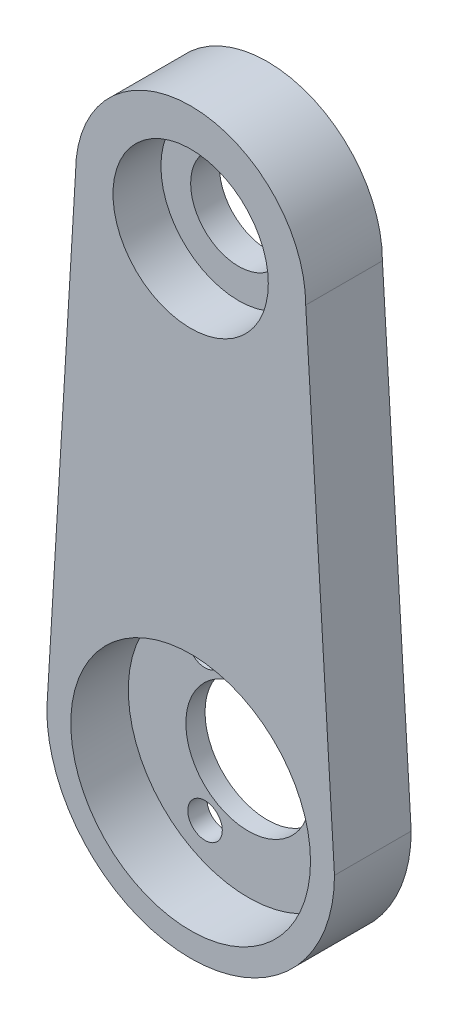
ISO-10303-21;
HEADER;
FILE_DESCRIPTION(('STEP AP214'),'2;1');
FILE_NAME('part.step','',(''),(''),'','','');
FILE_SCHEMA(('AUTOMOTIVE_DESIGN { 1 0 10303 214 1 1 1 1 }'));
ENDSEC;
DATA;
#1=APPLICATION_CONTEXT('core data for automotive mechanical design processes');
#2=APPLICATION_PROTOCOL_DEFINITION('international standard','automotive_design',2000,#1);
#3=PRODUCT_CONTEXT('',#1,'mechanical');
#4=PRODUCT('Part','Part','',(#3));
#5=PRODUCT_RELATED_PRODUCT_CATEGORY('part','',(#4));
#6=PRODUCT_DEFINITION_FORMATION('','',#4);
#7=PRODUCT_DEFINITION_CONTEXT('part definition',#1,'design');
#8=PRODUCT_DEFINITION('design','',#6,#7);
#9=PRODUCT_DEFINITION_SHAPE('','',#8);
#10=(LENGTH_UNIT() NAMED_UNIT(*) SI_UNIT(.MILLI.,.METRE.));
#11=(NAMED_UNIT(*) PLANE_ANGLE_UNIT() SI_UNIT($,.RADIAN.));
#12=(NAMED_UNIT(*) SI_UNIT($,.STERADIAN.) SOLID_ANGLE_UNIT());
#13=UNCERTAINTY_MEASURE_WITH_UNIT(LENGTH_MEASURE(1.E-05),#10,'distance_accuracy_value','');
#14=(GEOMETRIC_REPRESENTATION_CONTEXT(3) GLOBAL_UNCERTAINTY_ASSIGNED_CONTEXT((#13)) GLOBAL_UNIT_ASSIGNED_CONTEXT((#10,
#11,#12)) REPRESENTATION_CONTEXT('',''));
#15=CARTESIAN_POINT('',(0.,0.,0.));
#16=DIRECTION('',(0.,0.,1.));
#17=DIRECTION('',(1.,0.,0.));
#18=AXIS2_PLACEMENT_3D('',#15,#16,#17);
#19=CARTESIAN_POINT('',(0.,0.,-2.));
#20=DIRECTION('',(0.,0.,1.));
#21=DIRECTION('',(1.,0.,0.));
#22=AXIS2_PLACEMENT_3D('',#19,#20,#21);
#23=CYLINDRICAL_SURFACE('',#22,8.1);
#24=CARTESIAN_POINT('',(0.,0.,8.));
#25=DIRECTION('',(0.,0.,1.));
#26=DIRECTION('',(1.,0.,0.));
#27=AXIS2_PLACEMENT_3D('',#24,#25,#26);
#28=CIRCLE('',#27,8.1);
#29=CARTESIAN_POINT('',(8.1,0.,8.));
#30=VERTEX_POINT('',#29);
#31=EDGE_CURVE('E141',#30,#30,#28,.T.);
#32=ORIENTED_EDGE('',*,*,#31,.T.);
#33=EDGE_LOOP('',(#32));
#34=FACE_BOUND('',#33,.T.);
#35=CARTESIAN_POINT('',(0.,0.,3.));
#36=DIRECTION('',(0.,0.,-1.));
#37=DIRECTION('',(-1.,0.,0.));
#38=AXIS2_PLACEMENT_3D('',#35,#36,#37);
#39=CIRCLE('',#38,8.1);
#40=CARTESIAN_POINT('',(-8.1,0.,3.));
#41=VERTEX_POINT('',#40);
#42=EDGE_CURVE('E11',#41,#41,#39,.F.);
#43=ORIENTED_EDGE('',*,*,#42,.F.);
#44=EDGE_LOOP('',(#43));
#45=FACE_BOUND('',#44,.T.);
#46=ADVANCED_FACE('F38',(#34,#45),#23,.F.);
#47=CARTESIAN_POINT('',(0.,-50.,-2.));
#48=DIRECTION('',(0.,0.,1.));
#49=DIRECTION('',(1.,0.,0.));
#50=AXIS2_PLACEMENT_3D('',#47,#48,#49);
#51=CYLINDRICAL_SURFACE('',#50,6.5);
#52=CARTESIAN_POINT('',(0.,-50.,0.));
#53=DIRECTION('',(0.,0.,-1.));
#54=DIRECTION('',(-1.,0.,0.));
#55=AXIS2_PLACEMENT_3D('',#52,#53,#54);
#56=CIRCLE('',#55,6.5);
#57=CARTESIAN_POINT('',(-6.49999999999999,-50.,0.));
#58=VERTEX_POINT('',#57);
#59=EDGE_CURVE('E108',#58,#58,#56,.T.);
#60=ORIENTED_EDGE('',*,*,#59,.T.);
#61=EDGE_LOOP('',(#60));
#62=FACE_BOUND('',#61,.T.);
#63=CARTESIAN_POINT('',(0.,-50.,2.));
#64=DIRECTION('',(0.,0.,1.));
#65=DIRECTION('',(1.,0.,0.));
#66=AXIS2_PLACEMENT_3D('',#63,#64,#65);
#67=CIRCLE('',#66,6.5);
#68=CARTESIAN_POINT('',(6.50000000000001,-50.,2.));
#69=VERTEX_POINT('',#68);
#70=EDGE_CURVE('E122',#69,#69,#67,.F.);
#71=ORIENTED_EDGE('',*,*,#70,.F.);
#72=EDGE_LOOP('',(#71));
#73=FACE_BOUND('',#72,.T.);
#74=ADVANCED_FACE('F153',(#62,#73),#51,.F.);
#75=CARTESIAN_POINT('',(9.00000000000001,-50.,-2.));
#76=DIRECTION('',(0.,0.,1.));
#77=DIRECTION('',(1.,0.,0.));
#78=AXIS2_PLACEMENT_3D('',#75,#76,#77);
#79=CYLINDRICAL_SURFACE('',#78,1.8);
#80=CARTESIAN_POINT('',(9.00000000000001,-50.,0.));
#81=DIRECTION('',(0.,0.,-1.));
#82=DIRECTION('',(-1.,0.,0.));
#83=AXIS2_PLACEMENT_3D('',#80,#81,#82);
#84=CIRCLE('',#83,1.8);
#85=CARTESIAN_POINT('',(7.20000000000001,-50.,0.));
#86=VERTEX_POINT('',#85);
#87=EDGE_CURVE('E118',#86,#86,#84,.T.);
#88=ORIENTED_EDGE('',*,*,#87,.T.);
#89=EDGE_LOOP('',(#88));
#90=FACE_BOUND('',#89,.T.);
#91=CARTESIAN_POINT('',(9.00000000000001,-50.,2.));
#92=DIRECTION('',(0.,0.,1.));
#93=DIRECTION('',(1.,0.,0.));
#94=AXIS2_PLACEMENT_3D('',#91,#92,#93);
#95=CIRCLE('',#94,1.8);
#96=CARTESIAN_POINT('',(10.8,-50.,2.));
#97=VERTEX_POINT('',#96);
#98=EDGE_CURVE('E133',#97,#97,#95,.F.);
#99=ORIENTED_EDGE('',*,*,#98,.F.);
#100=EDGE_LOOP('',(#99));
#101=FACE_BOUND('',#100,.T.);
#102=ADVANCED_FACE('F155',(#90,#101),#79,.F.);
#103=CARTESIAN_POINT('',(-4.49999999999992,-42.20577136594,-2.));
#104=DIRECTION('',(0.,0.,1.));
#105=DIRECTION('',(1.,0.,0.));
#106=AXIS2_PLACEMENT_3D('',#103,#104,#105);
#107=CYLINDRICAL_SURFACE('',#106,1.8);
#108=CARTESIAN_POINT('',(-4.49999999999992,-42.20577136594,0.));
#109=DIRECTION('',(0.,0.,-1.));
#110=DIRECTION('',(-1.,0.,0.));
#111=AXIS2_PLACEMENT_3D('',#108,#109,#110);
#112=CIRCLE('',#111,1.8);
#113=CARTESIAN_POINT('',(-6.29999999999992,-42.20577136594,0.));
#114=VERTEX_POINT('',#113);
#115=EDGE_CURVE('E121',#114,#114,#112,.T.);
#116=ORIENTED_EDGE('',*,*,#115,.T.);
#117=EDGE_LOOP('',(#116));
#118=FACE_BOUND('',#117,.T.);
#119=CARTESIAN_POINT('',(-4.49999999999992,-42.20577136594,2.));
#120=DIRECTION('',(0.,0.,1.));
#121=DIRECTION('',(1.,0.,0.));
#122=AXIS2_PLACEMENT_3D('',#119,#120,#121);
#123=CIRCLE('',#122,1.8);
#124=CARTESIAN_POINT('',(-2.69999999999992,-42.20577136594,2.));
#125=VERTEX_POINT('',#124);
#126=EDGE_CURVE('E128',#125,#125,#123,.F.);
#127=ORIENTED_EDGE('',*,*,#126,.F.);
#128=EDGE_LOOP('',(#127));
#129=FACE_BOUND('',#128,.T.);
#130=ADVANCED_FACE('F162',(#118,#129),#107,.F.);
#131=CARTESIAN_POINT('',(-4.50000000000003,-57.7942286340599,-2.));
#132=DIRECTION('',(0.,0.,1.));
#133=DIRECTION('',(1.,0.,0.));
#134=AXIS2_PLACEMENT_3D('',#131,#132,#133);
#135=CYLINDRICAL_SURFACE('',#134,1.8);
#136=CARTESIAN_POINT('',(-4.50000000000003,-57.7942286340599,0.));
#137=DIRECTION('',(0.,0.,-1.));
#138=DIRECTION('',(-1.,0.,0.));
#139=AXIS2_PLACEMENT_3D('',#136,#137,#138);
#140=CIRCLE('',#139,1.8);
#141=CARTESIAN_POINT('',(-6.30000000000003,-57.7942286340599,0.));
#142=VERTEX_POINT('',#141);
#143=EDGE_CURVE('E117',#142,#142,#140,.T.);
#144=ORIENTED_EDGE('',*,*,#143,.T.);
#145=EDGE_LOOP('',(#144));
#146=FACE_BOUND('',#145,.T.);
#147=CARTESIAN_POINT('',(-4.50000000000003,-57.7942286340599,2.));
#148=DIRECTION('',(0.,0.,1.));
#149=DIRECTION('',(1.,0.,0.));
#150=AXIS2_PLACEMENT_3D('',#147,#148,#149);
#151=CIRCLE('',#150,1.8);
#152=CARTESIAN_POINT('',(-2.70000000000003,-57.7942286340599,2.));
#153=VERTEX_POINT('',#152);
#154=EDGE_CURVE('E126',#153,#153,#151,.F.);
#155=ORIENTED_EDGE('',*,*,#154,.F.);
#156=EDGE_LOOP('',(#155));
#157=FACE_BOUND('',#156,.T.);
#158=ADVANCED_FACE('F184',(#146,#157),#135,.F.);
#159=CARTESIAN_POINT('',(0.,0.,8.));
#160=DIRECTION('',(0.,0.,-1.));
#161=DIRECTION('',(-1.,0.,0.));
#162=AXIS2_PLACEMENT_3D('',#159,#160,#161);
#163=CYLINDRICAL_SURFACE('',#162,12.);
#164=CARTESIAN_POINT('',(0.,0.,0.));
#165=DIRECTION('',(0.,0.,1.));
#166=DIRECTION('',(-1.,0.,0.));
#167=AXIS2_PLACEMENT_3D('',#164,#165,#166);
#168=CIRCLE('',#167,12.);
#169=CARTESIAN_POINT('',(12.,0.,0.));
#170=VERTEX_POINT('',#169);
#171=CARTESIAN_POINT('',(-12.,0.,0.));
#172=VERTEX_POINT('',#171);
#173=EDGE_CURVE('E105',#170,#172,#168,.T.);
#174=ORIENTED_EDGE('',*,*,#173,.T.);
#175=DIRECTION('',(0.,0.,-1.));
#176=VECTOR('',#175,1.);
#177=CARTESIAN_POINT('',(-12.,0.,8.));
#178=LINE('',#177,#176);
#179=CARTESIAN_POINT('',(-12.,0.,8.));
#180=VERTEX_POINT('',#179);
#181=EDGE_CURVE('E47',#180,#172,#178,.T.);
#182=ORIENTED_EDGE('',*,*,#181,.F.);
#183=CARTESIAN_POINT('',(0.,0.,8.));
#184=DIRECTION('',(0.,0.,1.));
#185=DIRECTION('',(-1.,0.,0.));
#186=AXIS2_PLACEMENT_3D('',#183,#184,#185);
#187=CIRCLE('',#186,12.);
#188=CARTESIAN_POINT('',(12.,0.,8.));
#189=VERTEX_POINT('',#188);
#190=EDGE_CURVE('E91',#189,#180,#187,.T.);
#191=ORIENTED_EDGE('',*,*,#190,.F.);
#192=DIRECTION('',(0.,0.,-1.));
#193=VECTOR('',#192,1.);
#194=CARTESIAN_POINT('',(12.,0.,8.));
#195=LINE('',#194,#193);
#196=EDGE_CURVE('E101',#189,#170,#195,.T.);
#197=ORIENTED_EDGE('',*,*,#196,.T.);
#198=EDGE_LOOP('',(#174,#182,#191,#197));
#199=FACE_BOUND('',#198,.T.);
#200=ADVANCED_FACE('F40',(#199),#163,.T.);
#201=CARTESIAN_POINT('',(-12.,0.,8.));
#202=DIRECTION('',(0.998204845465779,-0.0598922907279466,0.));
#203=DIRECTION('',(0.0598922907279466,0.998204845465779,0.));
#204=AXIS2_PLACEMENT_3D('',#201,#202,#203);
#205=PLANE('',#204);
#206=DIRECTION('',(-0.0598922907279466,-0.998204845465779,0.));
#207=VECTOR('',#206,1.);
#208=CARTESIAN_POINT('',(-12.,0.,0.));
#209=LINE('',#208,#207);
#210=CARTESIAN_POINT('',(-15.,-50.,0.));
#211=VERTEX_POINT('',#210);
#212=EDGE_CURVE('E96',#172,#211,#209,.T.);
#213=ORIENTED_EDGE('',*,*,#212,.T.);
#214=DIRECTION('',(0.,0.,-1.));
#215=VECTOR('',#214,1.);
#216=CARTESIAN_POINT('',(-15.,-50.,8.));
#217=LINE('',#216,#215);
#218=CARTESIAN_POINT('',(-15.,-50.,8.));
#219=VERTEX_POINT('',#218);
#220=EDGE_CURVE('E94',#219,#211,#217,.T.);
#221=ORIENTED_EDGE('',*,*,#220,.F.);
#222=DIRECTION('',(-0.0598922907279466,-0.998204845465779,0.));
#223=VECTOR('',#222,1.);
#224=CARTESIAN_POINT('',(-12.,0.,8.));
#225=LINE('',#224,#223);
#226=EDGE_CURVE('E86',#180,#219,#225,.T.);
#227=ORIENTED_EDGE('',*,*,#226,.F.);
#228=ORIENTED_EDGE('',*,*,#181,.T.);
#229=EDGE_LOOP('',(#213,#221,#227,#228));
#230=FACE_BOUND('',#229,.T.);
#231=ADVANCED_FACE('F95',(#230),#205,.F.);
#232=CARTESIAN_POINT('',(0.,-50.,8.));
#233=DIRECTION('',(0.,0.,-1.));
#234=DIRECTION('',(-1.,0.,0.));
#235=AXIS2_PLACEMENT_3D('',#232,#233,#234);
#236=CYLINDRICAL_SURFACE('',#235,15.);
#237=CARTESIAN_POINT('',(0.,-50.,0.));
#238=DIRECTION('',(0.,0.,1.));
#239=DIRECTION('',(1.,0.,0.));
#240=AXIS2_PLACEMENT_3D('',#237,#238,#239);
#241=CIRCLE('',#240,15.);
#242=CARTESIAN_POINT('',(15.,-50.,0.));
#243=VERTEX_POINT('',#242);
#244=EDGE_CURVE('E72',#211,#243,#241,.T.);
#245=ORIENTED_EDGE('',*,*,#244,.T.);
#246=DIRECTION('',(0.,0.,-1.));
#247=VECTOR('',#246,1.);
#248=CARTESIAN_POINT('',(15.,-50.,8.));
#249=LINE('',#248,#247);
#250=CARTESIAN_POINT('',(15.,-50.,8.));
#251=VERTEX_POINT('',#250);
#252=EDGE_CURVE('E97',#251,#243,#249,.T.);
#253=ORIENTED_EDGE('',*,*,#252,.F.);
#254=CARTESIAN_POINT('',(0.,-50.,8.));
#255=DIRECTION('',(0.,0.,1.));
#256=DIRECTION('',(1.,0.,0.));
#257=AXIS2_PLACEMENT_3D('',#254,#255,#256);
#258=CIRCLE('',#257,15.);
#259=EDGE_CURVE('E89',#219,#251,#258,.T.);
#260=ORIENTED_EDGE('',*,*,#259,.F.);
#261=ORIENTED_EDGE('',*,*,#220,.T.);
#262=EDGE_LOOP('',(#245,#253,#260,#261));
#263=FACE_BOUND('',#262,.T.);
#264=ADVANCED_FACE('F99',(#263),#236,.T.);
#265=CARTESIAN_POINT('',(12.,0.,8.));
#266=DIRECTION('',(-0.998204845465779,-0.0598922907279466,0.));
#267=DIRECTION('',(0.0598922907279466,-0.998204845465779,0.));
#268=AXIS2_PLACEMENT_3D('',#265,#266,#267);
#269=PLANE('',#268);
#270=DIRECTION('',(-0.0598922907279466,0.998204845465779,0.));
#271=VECTOR('',#270,1.);
#272=CARTESIAN_POINT('',(12.,0.,0.));
#273=LINE('',#272,#271);
#274=EDGE_CURVE('E78',#243,#170,#273,.T.);
#275=ORIENTED_EDGE('',*,*,#274,.T.);
#276=ORIENTED_EDGE('',*,*,#196,.F.);
#277=DIRECTION('',(-0.0598922907279466,0.998204845465779,0.));
#278=VECTOR('',#277,1.);
#279=CARTESIAN_POINT('',(12.,0.,8.));
#280=LINE('',#279,#278);
#281=EDGE_CURVE('E55',#251,#189,#280,.T.);
#282=ORIENTED_EDGE('',*,*,#281,.F.);
#283=ORIENTED_EDGE('',*,*,#252,.T.);
#284=EDGE_LOOP('',(#275,#276,#282,#283));
#285=FACE_BOUND('',#284,.T.);
#286=ADVANCED_FACE('F172',(#285),#269,.F.);
#287=CARTESIAN_POINT('',(0.,0.,8.));
#288=DIRECTION('',(0.,0.,-1.));
#289=DIRECTION('',(-1.,0.,0.));
#290=AXIS2_PLACEMENT_3D('',#287,#288,#289);
#291=PLANE('',#290);
#292=ORIENTED_EDGE('',*,*,#31,.F.);
#293=EDGE_LOOP('',(#292));
#294=FACE_BOUND('',#293,.T.);
#295=CARTESIAN_POINT('',(0.,-50.,8.));
#296=DIRECTION('',(0.,0.,1.));
#297=DIRECTION('',(1.,0.,0.));
#298=AXIS2_PLACEMENT_3D('',#295,#296,#297);
#299=CIRCLE('',#298,12.5);
#300=CARTESIAN_POINT('',(12.5,-50.,8.));
#301=VERTEX_POINT('',#300);
#302=EDGE_CURVE('E136',#301,#301,#299,.T.);
#303=ORIENTED_EDGE('',*,*,#302,.F.);
#304=EDGE_LOOP('',(#303));
#305=FACE_BOUND('',#304,.T.);
#306=ORIENTED_EDGE('',*,*,#190,.T.);
#307=ORIENTED_EDGE('',*,*,#226,.T.);
#308=ORIENTED_EDGE('',*,*,#259,.T.);
#309=ORIENTED_EDGE('',*,*,#281,.T.);
#310=EDGE_LOOP('',(#306,#307,#308,#309));
#311=FACE_BOUND('',#310,.T.);
#312=ADVANCED_FACE('F87',(#294,#305,#311),#291,.F.);
#313=CARTESIAN_POINT('',(0.,0.,0.));
#314=DIRECTION('',(0.,0.,-1.));
#315=DIRECTION('',(-1.,0.,0.));
#316=AXIS2_PLACEMENT_3D('',#313,#314,#315);
#317=PLANE('',#316);
#318=ORIENTED_EDGE('',*,*,#143,.F.);
#319=EDGE_LOOP('',(#318));
#320=FACE_BOUND('',#319,.T.);
#321=ORIENTED_EDGE('',*,*,#115,.F.);
#322=EDGE_LOOP('',(#321));
#323=FACE_BOUND('',#322,.T.);
#324=ORIENTED_EDGE('',*,*,#87,.F.);
#325=EDGE_LOOP('',(#324));
#326=FACE_BOUND('',#325,.T.);
#327=ORIENTED_EDGE('',*,*,#59,.F.);
#328=EDGE_LOOP('',(#327));
#329=FACE_BOUND('',#328,.T.);
#330=ORIENTED_EDGE('',*,*,#173,.F.);
#331=ORIENTED_EDGE('',*,*,#274,.F.);
#332=ORIENTED_EDGE('',*,*,#244,.F.);
#333=ORIENTED_EDGE('',*,*,#212,.F.);
#334=EDGE_LOOP('',(#330,#331,#332,#333));
#335=FACE_BOUND('',#334,.T.);
#336=CARTESIAN_POINT('',(0.,0.,0.));
#337=DIRECTION('',(0.,0.,-1.));
#338=DIRECTION('',(-1.,0.,0.));
#339=AXIS2_PLACEMENT_3D('',#336,#337,#338);
#340=CIRCLE('',#339,5.);
#341=CARTESIAN_POINT('',(-5.,0.,0.));
#342=VERTEX_POINT('',#341);
#343=EDGE_CURVE('E196',#342,#342,#340,.T.);
#344=ORIENTED_EDGE('',*,*,#343,.F.);
#345=EDGE_LOOP('',(#344));
#346=FACE_BOUND('',#345,.T.);
#347=ADVANCED_FACE('F171',(#320,#323,#326,#329,#335,#346),#317,.T.);
#348=CARTESIAN_POINT('',(0.,-50.,2.));
#349=DIRECTION('',(0.,0.,1.));
#350=DIRECTION('',(1.,0.,0.));
#351=AXIS2_PLACEMENT_3D('',#348,#349,#350);
#352=PLANE('',#351);
#353=CARTESIAN_POINT('',(0.,-50.,2.));
#354=DIRECTION('',(0.,0.,1.));
#355=DIRECTION('',(1.,0.,0.));
#356=AXIS2_PLACEMENT_3D('',#353,#354,#355);
#357=CIRCLE('',#356,12.5);
#358=CARTESIAN_POINT('',(12.5,-50.,2.));
#359=VERTEX_POINT('',#358);
#360=EDGE_CURVE('E129',#359,#359,#357,.T.);
#361=ORIENTED_EDGE('',*,*,#360,.T.);
#362=EDGE_LOOP('',(#361));
#363=FACE_BOUND('',#362,.T.);
#364=ORIENTED_EDGE('',*,*,#154,.T.);
#365=EDGE_LOOP('',(#364));
#366=FACE_BOUND('',#365,.T.);
#367=ORIENTED_EDGE('',*,*,#126,.T.);
#368=EDGE_LOOP('',(#367));
#369=FACE_BOUND('',#368,.T.);
#370=ORIENTED_EDGE('',*,*,#98,.T.);
#371=EDGE_LOOP('',(#370));
#372=FACE_BOUND('',#371,.T.);
#373=ORIENTED_EDGE('',*,*,#70,.T.);
#374=EDGE_LOOP('',(#373));
#375=FACE_BOUND('',#374,.T.);
#376=ADVANCED_FACE('F151',(#363,#366,#369,#372,#375),#352,.T.);
#377=CARTESIAN_POINT('',(0.,-50.,2.));
#378=DIRECTION('',(0.,0.,1.));
#379=DIRECTION('',(1.,0.,0.));
#380=AXIS2_PLACEMENT_3D('',#377,#378,#379);
#381=CYLINDRICAL_SURFACE('',#380,12.5);
#382=ORIENTED_EDGE('',*,*,#360,.F.);
#383=EDGE_LOOP('',(#382));
#384=FACE_BOUND('',#383,.T.);
#385=ORIENTED_EDGE('',*,*,#302,.T.);
#386=EDGE_LOOP('',(#385));
#387=FACE_BOUND('',#386,.T.);
#388=ADVANCED_FACE('F209',(#384,#387),#381,.F.);
#389=CARTESIAN_POINT('',(0.,0.,3.));
#390=DIRECTION('',(0.,0.,-1.));
#391=DIRECTION('',(-1.,0.,0.));
#392=AXIS2_PLACEMENT_3D('',#389,#390,#391);
#393=PLANE('',#392);
#394=CARTESIAN_POINT('',(0.,0.,3.));
#395=DIRECTION('',(0.,0.,-1.));
#396=DIRECTION('',(-1.,0.,0.));
#397=AXIS2_PLACEMENT_3D('',#394,#395,#396);
#398=CIRCLE('',#397,5.);
#399=CARTESIAN_POINT('',(-5.,0.,3.));
#400=VERTEX_POINT('',#399);
#401=EDGE_CURVE('E198',#400,#400,#398,.T.);
#402=ORIENTED_EDGE('',*,*,#401,.T.);
#403=EDGE_LOOP('',(#402));
#404=FACE_BOUND('',#403,.T.);
#405=ORIENTED_EDGE('',*,*,#42,.T.);
#406=EDGE_LOOP('',(#405));
#407=FACE_BOUND('',#406,.T.);
#408=ADVANCED_FACE('F211',(#404,#407),#393,.F.);
#409=CARTESIAN_POINT('',(0.,0.,3.));
#410=DIRECTION('',(0.,0.,-1.));
#411=DIRECTION('',(-1.,0.,0.));
#412=AXIS2_PLACEMENT_3D('',#409,#410,#411);
#413=CYLINDRICAL_SURFACE('',#412,5.);
#414=ORIENTED_EDGE('',*,*,#401,.F.);
#415=EDGE_LOOP('',(#414));
#416=FACE_BOUND('',#415,.T.);
#417=ORIENTED_EDGE('',*,*,#343,.T.);
#418=EDGE_LOOP('',(#417));
#419=FACE_BOUND('',#418,.T.);
#420=ADVANCED_FACE('F218',(#416,#419),#413,.F.);
#421=CLOSED_SHELL('',(#46,#74,#102,#130,#158,#200,#231,#264,#286,#312,#347,#376,#388,#408,#420));
#422=MANIFOLD_SOLID_BREP('B2',#421);
#423=ADVANCED_BREP_SHAPE_REPRESENTATION('',(#18,#422),#14);
#424=SHAPE_DEFINITION_REPRESENTATION(#9,#423);
ENDSEC;
END-ISO-10303-21;
